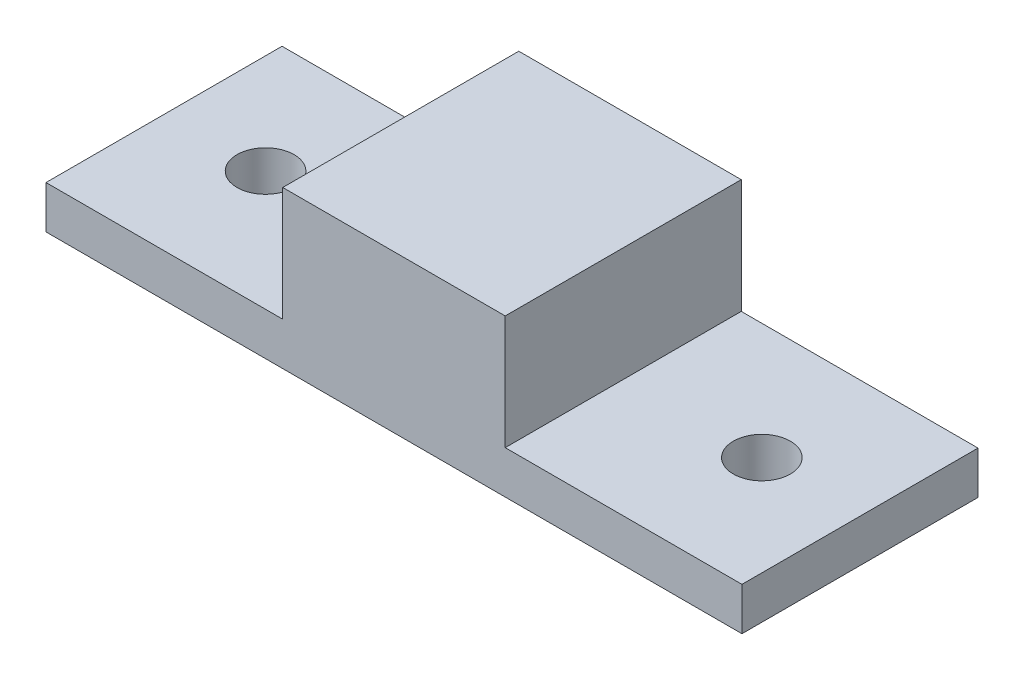
ISO-10303-21;
HEADER;
FILE_DESCRIPTION(('STEP AP214'),'2;1');
FILE_NAME('part.step','',(''),(''),'','','');
FILE_SCHEMA(('AUTOMOTIVE_DESIGN { 1 0 10303 214 1 1 1 1 }'));
ENDSEC;
DATA;
#1=APPLICATION_CONTEXT('core data for automotive mechanical design processes');
#2=APPLICATION_PROTOCOL_DEFINITION('international standard','automotive_design',2000,#1);
#3=PRODUCT_CONTEXT('',#1,'mechanical');
#4=PRODUCT('Part','Part','',(#3));
#5=PRODUCT_RELATED_PRODUCT_CATEGORY('part','',(#4));
#6=PRODUCT_DEFINITION_FORMATION('','',#4);
#7=PRODUCT_DEFINITION_CONTEXT('part definition',#1,'design');
#8=PRODUCT_DEFINITION('design','',#6,#7);
#9=PRODUCT_DEFINITION_SHAPE('','',#8);
#10=(LENGTH_UNIT() NAMED_UNIT(*) SI_UNIT(.MILLI.,.METRE.));
#11=(NAMED_UNIT(*) PLANE_ANGLE_UNIT() SI_UNIT($,.RADIAN.));
#12=(NAMED_UNIT(*) SI_UNIT($,.STERADIAN.) SOLID_ANGLE_UNIT());
#13=UNCERTAINTY_MEASURE_WITH_UNIT(LENGTH_MEASURE(1.E-05),#10,'distance_accuracy_value','');
#14=(GEOMETRIC_REPRESENTATION_CONTEXT(3) GLOBAL_UNCERTAINTY_ASSIGNED_CONTEXT((#13)) GLOBAL_UNIT_ASSIGNED_CONTEXT((#10,
#11,#12)) REPRESENTATION_CONTEXT('',''));
#15=CARTESIAN_POINT('',(0.,0.,0.));
#16=DIRECTION('',(0.,0.,1.));
#17=DIRECTION('',(1.,0.,0.));
#18=AXIS2_PLACEMENT_3D('',#15,#16,#17);
#19=CARTESIAN_POINT('',(0.,3.81,0.));
#20=DIRECTION('',(0.,-1.,0.));
#21=DIRECTION('',(0.,0.,-1.));
#22=AXIS2_PLACEMENT_3D('',#19,#20,#21);
#23=PLANE('',#22);
#24=CARTESIAN_POINT('',(8.89,3.81,-10.6609746324194));
#25=DIRECTION('',(0.,1.,0.));
#26=DIRECTION('',(0.,0.,1.));
#27=AXIS2_PLACEMENT_3D('',#24,#25,#26);
#28=CIRCLE('',#27,2.54);
#29=CARTESIAN_POINT('',(8.89,3.81,-13.2009746324194));
#30=VERTEX_POINT('',#29);
#31=EDGE_CURVE('E133',#30,#30,#28,.T.);
#32=ORIENTED_EDGE('',*,*,#31,.F.);
#33=EDGE_LOOP('',(#32));
#34=FACE_BOUND('',#33,.T.);
#35=DIRECTION('',(0.,0.,1.));
#36=VECTOR('',#35,1.);
#37=CARTESIAN_POINT('',(21.082,3.81,-21.019262));
#38=LINE('',#37,#36);
#39=CARTESIAN_POINT('',(21.082,3.81,-21.019262));
#40=VERTEX_POINT('',#39);
#41=CARTESIAN_POINT('',(21.082,3.81,0.));
#42=VERTEX_POINT('',#41);
#43=EDGE_CURVE('E50',#40,#42,#38,.T.);
#44=ORIENTED_EDGE('',*,*,#43,.F.);
#45=DIRECTION('',(-1.,0.,0.));
#46=VECTOR('',#45,1.);
#47=CARTESIAN_POINT('',(0.,3.81,-21.019262));
#48=LINE('',#47,#46);
#49=CARTESIAN_POINT('',(0.,3.81,-21.019262));
#50=VERTEX_POINT('',#49);
#51=EDGE_CURVE('E148',#40,#50,#48,.T.);
#52=ORIENTED_EDGE('',*,*,#51,.T.);
#53=DIRECTION('',(0.,0.,1.));
#54=VECTOR('',#53,1.);
#55=CARTESIAN_POINT('',(0.,3.81,0.));
#56=LINE('',#55,#54);
#57=CARTESIAN_POINT('',(0.,3.81,0.));
#58=VERTEX_POINT('',#57);
#59=EDGE_CURVE('E139',#50,#58,#56,.T.);
#60=ORIENTED_EDGE('',*,*,#59,.T.);
#61=DIRECTION('',(1.,0.,0.));
#62=VECTOR('',#61,1.);
#63=CARTESIAN_POINT('',(0.,3.81,0.));
#64=LINE('',#63,#62);
#65=EDGE_CURVE('E144',#58,#42,#64,.T.);
#66=ORIENTED_EDGE('',*,*,#65,.T.);
#67=EDGE_LOOP('',(#44,#52,#60,#66));
#68=FACE_BOUND('',#67,.T.);
#69=ADVANCED_FACE('F35',(#34,#68),#23,.F.);
#70=CARTESIAN_POINT('',(53.086,3.81,-10.6609746324194));
#71=DIRECTION('',(0.,1.,0.));
#72=DIRECTION('',(0.,0.,1.));
#73=AXIS2_PLACEMENT_3D('',#70,#71,#72);
#74=CIRCLE('',#73,2.54);
#75=CARTESIAN_POINT('',(53.086,3.81,-13.2009746324194));
#76=VERTEX_POINT('',#75);
#77=EDGE_CURVE('E124',#76,#76,#74,.T.);
#78=ORIENTED_EDGE('',*,*,#77,.F.);
#79=EDGE_LOOP('',(#78));
#80=FACE_BOUND('',#79,.T.);
#81=DIRECTION('',(0.,0.,-1.));
#82=VECTOR('',#81,1.);
#83=CARTESIAN_POINT('',(40.894,3.81,-21.019262));
#84=LINE('',#83,#82);
#85=CARTESIAN_POINT('',(40.894,3.81,0.));
#86=VERTEX_POINT('',#85);
#87=CARTESIAN_POINT('',(40.894,3.81,-21.019262));
#88=VERTEX_POINT('',#87);
#89=EDGE_CURVE('E58',#86,#88,#84,.T.);
#90=ORIENTED_EDGE('',*,*,#89,.F.);
#91=CARTESIAN_POINT('',(61.976,3.81,0.));
#92=VERTEX_POINT('',#91);
#93=EDGE_CURVE('E142',#86,#92,#64,.T.);
#94=ORIENTED_EDGE('',*,*,#93,.T.);
#95=DIRECTION('',(0.,0.,-1.));
#96=VECTOR('',#95,1.);
#97=CARTESIAN_POINT('',(61.976,3.81,0.));
#98=LINE('',#97,#96);
#99=CARTESIAN_POINT('',(61.976,3.81,-21.019262));
#100=VERTEX_POINT('',#99);
#101=EDGE_CURVE('E146',#92,#100,#98,.T.);
#102=ORIENTED_EDGE('',*,*,#101,.T.);
#103=EDGE_CURVE('E149',#100,#88,#48,.T.);
#104=ORIENTED_EDGE('',*,*,#103,.T.);
#105=EDGE_LOOP('',(#90,#94,#102,#104));
#106=FACE_BOUND('',#105,.T.);
#107=ADVANCED_FACE('F192',(#80,#106),#23,.F.);
#108=CARTESIAN_POINT('',(0.,0.,0.));
#109=DIRECTION('',(0.,-1.,0.));
#110=DIRECTION('',(0.,0.,-1.));
#111=AXIS2_PLACEMENT_3D('',#108,#109,#110);
#112=PLANE('',#111);
#113=CARTESIAN_POINT('',(8.89,0.,-10.6609746324194));
#114=DIRECTION('',(0.,1.,0.));
#115=DIRECTION('',(0.,0.,1.));
#116=AXIS2_PLACEMENT_3D('',#113,#114,#115);
#117=CIRCLE('',#116,2.54);
#118=CARTESIAN_POINT('',(8.89,0.,-13.2009746324194));
#119=VERTEX_POINT('',#118);
#120=EDGE_CURVE('E131',#119,#119,#117,.T.);
#121=ORIENTED_EDGE('',*,*,#120,.T.);
#122=EDGE_LOOP('',(#121));
#123=FACE_BOUND('',#122,.T.);
#124=DIRECTION('',(0.,0.,1.));
#125=VECTOR('',#124,1.);
#126=CARTESIAN_POINT('',(0.,0.,0.));
#127=LINE('',#126,#125);
#128=CARTESIAN_POINT('',(0.,0.,-21.019262));
#129=VERTEX_POINT('',#128);
#130=CARTESIAN_POINT('',(0.,0.,0.));
#131=VERTEX_POINT('',#130);
#132=EDGE_CURVE('E136',#129,#131,#127,.T.);
#133=ORIENTED_EDGE('',*,*,#132,.F.);
#134=DIRECTION('',(-1.,0.,0.));
#135=VECTOR('',#134,1.);
#136=CARTESIAN_POINT('',(0.,0.,-21.019262));
#137=LINE('',#136,#135);
#138=CARTESIAN_POINT('',(61.976,0.,-21.019262));
#139=VERTEX_POINT('',#138);
#140=EDGE_CURVE('E143',#139,#129,#137,.T.);
#141=ORIENTED_EDGE('',*,*,#140,.F.);
#142=DIRECTION('',(0.,0.,-1.));
#143=VECTOR('',#142,1.);
#144=CARTESIAN_POINT('',(61.976,0.,0.));
#145=LINE('',#144,#143);
#146=CARTESIAN_POINT('',(61.976,0.,0.));
#147=VERTEX_POINT('',#146);
#148=EDGE_CURVE('E156',#147,#139,#145,.T.);
#149=ORIENTED_EDGE('',*,*,#148,.F.);
#150=DIRECTION('',(1.,0.,0.));
#151=VECTOR('',#150,1.);
#152=CARTESIAN_POINT('',(0.,0.,0.));
#153=LINE('',#152,#151);
#154=EDGE_CURVE('E154',#131,#147,#153,.T.);
#155=ORIENTED_EDGE('',*,*,#154,.F.);
#156=EDGE_LOOP('',(#133,#141,#149,#155));
#157=FACE_BOUND('',#156,.T.);
#158=CARTESIAN_POINT('',(53.086,0.,-10.6609746324194));
#159=DIRECTION('',(0.,1.,0.));
#160=DIRECTION('',(0.,0.,1.));
#161=AXIS2_PLACEMENT_3D('',#158,#159,#160);
#162=CIRCLE('',#161,2.54);
#163=CARTESIAN_POINT('',(53.086,0.,-13.2009746324194));
#164=VERTEX_POINT('',#163);
#165=EDGE_CURVE('E121',#164,#164,#162,.T.);
#166=ORIENTED_EDGE('',*,*,#165,.T.);
#167=EDGE_LOOP('',(#166));
#168=FACE_BOUND('',#167,.T.);
#169=ADVANCED_FACE('F173',(#123,#157,#168),#112,.T.);
#170=CARTESIAN_POINT('',(0.,3.81,0.));
#171=DIRECTION('',(1.,0.,0.));
#172=DIRECTION('',(0.,0.,-1.));
#173=AXIS2_PLACEMENT_3D('',#170,#171,#172);
#174=PLANE('',#173);
#175=ORIENTED_EDGE('',*,*,#132,.T.);
#176=DIRECTION('',(0.,-1.,0.));
#177=VECTOR('',#176,1.);
#178=CARTESIAN_POINT('',(0.,3.81,0.));
#179=LINE('',#178,#177);
#180=EDGE_CURVE('E11',#58,#131,#179,.T.);
#181=ORIENTED_EDGE('',*,*,#180,.F.);
#182=ORIENTED_EDGE('',*,*,#59,.F.);
#183=DIRECTION('',(0.,-1.,0.));
#184=VECTOR('',#183,1.);
#185=CARTESIAN_POINT('',(0.,3.81,-21.019262));
#186=LINE('',#185,#184);
#187=EDGE_CURVE('E151',#50,#129,#186,.T.);
#188=ORIENTED_EDGE('',*,*,#187,.T.);
#189=EDGE_LOOP('',(#175,#181,#182,#188));
#190=FACE_BOUND('',#189,.T.);
#191=ADVANCED_FACE('F37',(#190),#174,.F.);
#192=CARTESIAN_POINT('',(0.,3.81,0.));
#193=DIRECTION('',(0.,0.,-1.));
#194=DIRECTION('',(-1.,0.,0.));
#195=AXIS2_PLACEMENT_3D('',#192,#193,#194);
#196=PLANE('',#195);
#197=ORIENTED_EDGE('',*,*,#154,.T.);
#198=DIRECTION('',(0.,-1.,0.));
#199=VECTOR('',#198,1.);
#200=CARTESIAN_POINT('',(61.976,3.81,0.));
#201=LINE('',#200,#199);
#202=EDGE_CURVE('E43',#92,#147,#201,.T.);
#203=ORIENTED_EDGE('',*,*,#202,.F.);
#204=ORIENTED_EDGE('',*,*,#93,.F.);
#205=DIRECTION('',(0.,-1.,0.));
#206=VECTOR('',#205,1.);
#207=CARTESIAN_POINT('',(40.894,13.97,0.));
#208=LINE('',#207,#206);
#209=CARTESIAN_POINT('',(40.894,13.97,0.));
#210=VERTEX_POINT('',#209);
#211=EDGE_CURVE('E106',#210,#86,#208,.T.);
#212=ORIENTED_EDGE('',*,*,#211,.F.);
#213=DIRECTION('',(1.,0.,0.));
#214=VECTOR('',#213,1.);
#215=CARTESIAN_POINT('',(21.082,13.97,0.));
#216=LINE('',#215,#214);
#217=CARTESIAN_POINT('',(21.082,13.97,0.));
#218=VERTEX_POINT('',#217);
#219=EDGE_CURVE('E100',#218,#210,#216,.T.);
#220=ORIENTED_EDGE('',*,*,#219,.F.);
#221=DIRECTION('',(0.,-1.,0.));
#222=VECTOR('',#221,1.);
#223=CARTESIAN_POINT('',(21.082,13.97,0.));
#224=LINE('',#223,#222);
#225=EDGE_CURVE('E104',#218,#42,#224,.T.);
#226=ORIENTED_EDGE('',*,*,#225,.T.);
#227=ORIENTED_EDGE('',*,*,#65,.F.);
#228=ORIENTED_EDGE('',*,*,#180,.T.);
#229=EDGE_LOOP('',(#197,#203,#204,#212,#220,#226,#227,#228));
#230=FACE_BOUND('',#229,.T.);
#231=ADVANCED_FACE('F102',(#230),#196,.F.);
#232=CARTESIAN_POINT('',(61.976,3.81,0.));
#233=DIRECTION('',(-1.,0.,0.));
#234=DIRECTION('',(0.,0.,1.));
#235=AXIS2_PLACEMENT_3D('',#232,#233,#234);
#236=PLANE('',#235);
#237=ORIENTED_EDGE('',*,*,#148,.T.);
#238=DIRECTION('',(0.,-1.,0.));
#239=VECTOR('',#238,1.);
#240=CARTESIAN_POINT('',(61.976,3.81,-21.019262));
#241=LINE('',#240,#239);
#242=EDGE_CURVE('E161',#100,#139,#241,.T.);
#243=ORIENTED_EDGE('',*,*,#242,.F.);
#244=ORIENTED_EDGE('',*,*,#101,.F.);
#245=ORIENTED_EDGE('',*,*,#202,.T.);
#246=EDGE_LOOP('',(#237,#243,#244,#245));
#247=FACE_BOUND('',#246,.T.);
#248=ADVANCED_FACE('F168',(#247),#236,.F.);
#249=CARTESIAN_POINT('',(0.,3.81,-21.019262));
#250=DIRECTION('',(0.,0.,1.));
#251=DIRECTION('',(1.,0.,0.));
#252=AXIS2_PLACEMENT_3D('',#249,#250,#251);
#253=PLANE('',#252);
#254=ORIENTED_EDGE('',*,*,#140,.T.);
#255=ORIENTED_EDGE('',*,*,#187,.F.);
#256=ORIENTED_EDGE('',*,*,#51,.F.);
#257=DIRECTION('',(0.,-1.,0.));
#258=VECTOR('',#257,1.);
#259=CARTESIAN_POINT('',(21.082,13.97,-21.019262));
#260=LINE('',#259,#258);
#261=CARTESIAN_POINT('',(21.082,13.97,-21.019262));
#262=VERTEX_POINT('',#261);
#263=EDGE_CURVE('E182',#262,#40,#260,.T.);
#264=ORIENTED_EDGE('',*,*,#263,.F.);
#265=DIRECTION('',(-1.,0.,0.));
#266=VECTOR('',#265,1.);
#267=CARTESIAN_POINT('',(21.082,13.97,-21.019262));
#268=LINE('',#267,#266);
#269=CARTESIAN_POINT('',(40.894,13.97,-21.019262));
#270=VERTEX_POINT('',#269);
#271=EDGE_CURVE('E115',#270,#262,#268,.T.);
#272=ORIENTED_EDGE('',*,*,#271,.F.);
#273=DIRECTION('',(0.,-1.,0.));
#274=VECTOR('',#273,1.);
#275=CARTESIAN_POINT('',(40.894,13.97,-21.019262));
#276=LINE('',#275,#274);
#277=EDGE_CURVE('E126',#270,#88,#276,.T.);
#278=ORIENTED_EDGE('',*,*,#277,.T.);
#279=ORIENTED_EDGE('',*,*,#103,.F.);
#280=ORIENTED_EDGE('',*,*,#242,.T.);
#281=EDGE_LOOP('',(#254,#255,#256,#264,#272,#278,#279,#280));
#282=FACE_BOUND('',#281,.T.);
#283=ADVANCED_FACE('F177',(#282),#253,.F.);
#284=CARTESIAN_POINT('',(8.89,3.81,-10.6609746324194));
#285=DIRECTION('',(0.,-1.,0.));
#286=DIRECTION('',(0.,0.,-1.));
#287=AXIS2_PLACEMENT_3D('',#284,#285,#286);
#288=CYLINDRICAL_SURFACE('',#287,2.54);
#289=CARTESIAN_POINT('',(8.89,3.81,-13.2009746324194));
#290=CARTESIAN_POINT('',(8.89,3.7703125,-13.2009746324194));
#291=CARTESIAN_POINT('',(8.89,3.730625,-13.2009746324194));
#292=CARTESIAN_POINT('',(8.89,3.65125,-13.2009746324194));
#293=CARTESIAN_POINT('',(8.89,3.6115625,-13.2009746324194));
#294=CARTESIAN_POINT('',(8.89,3.5321875,-13.2009746324194));
#295=CARTESIAN_POINT('',(8.89,3.4925,-13.2009746324194));
#296=CARTESIAN_POINT('',(8.89,3.413125,-13.2009746324194));
#297=CARTESIAN_POINT('',(8.89,3.3734375,-13.2009746324194));
#298=CARTESIAN_POINT('',(8.89,3.2940625,-13.2009746324194));
#299=CARTESIAN_POINT('',(8.89,3.254375,-13.2009746324194));
#300=CARTESIAN_POINT('',(8.89,3.175,-13.2009746324194));
#301=CARTESIAN_POINT('',(8.89,3.1353125,-13.2009746324194));
#302=CARTESIAN_POINT('',(8.89,3.0559375,-13.2009746324194));
#303=CARTESIAN_POINT('',(8.89,3.01625,-13.2009746324194));
#304=CARTESIAN_POINT('',(8.89,2.936875,-13.2009746324194));
#305=CARTESIAN_POINT('',(8.89,2.8971875,-13.2009746324194));
#306=CARTESIAN_POINT('',(8.89,2.8178125,-13.2009746324194));
#307=CARTESIAN_POINT('',(8.89,2.778125,-13.2009746324194));
#308=CARTESIAN_POINT('',(8.89,2.69875,-13.2009746324194));
#309=CARTESIAN_POINT('',(8.89,2.6590625,-13.2009746324194));
#310=CARTESIAN_POINT('',(8.89,2.5796875,-13.2009746324194));
#311=CARTESIAN_POINT('',(8.89,2.54,-13.2009746324194));
#312=CARTESIAN_POINT('',(8.89,2.460625,-13.2009746324194));
#313=CARTESIAN_POINT('',(8.89,2.4209375,-13.2009746324194));
#314=CARTESIAN_POINT('',(8.89,2.3415625,-13.2009746324194));
#315=CARTESIAN_POINT('',(8.89,2.301875,-13.2009746324194));
#316=CARTESIAN_POINT('',(8.89,2.2225,-13.2009746324194));
#317=CARTESIAN_POINT('',(8.89,2.1828125,-13.2009746324194));
#318=CARTESIAN_POINT('',(8.89,2.1034375,-13.2009746324194));
#319=CARTESIAN_POINT('',(8.89,2.06375,-13.2009746324194));
#320=CARTESIAN_POINT('',(8.89,1.984375,-13.2009746324194));
#321=CARTESIAN_POINT('',(8.89,1.9446875,-13.2009746324194));
#322=CARTESIAN_POINT('',(8.89,1.8653125,-13.2009746324194));
#323=CARTESIAN_POINT('',(8.89,1.825625,-13.2009746324194));
#324=CARTESIAN_POINT('',(8.89,1.74625,-13.2009746324194));
#325=CARTESIAN_POINT('',(8.89,1.7065625,-13.2009746324194));
#326=CARTESIAN_POINT('',(8.89,1.6271875,-13.2009746324194));
#327=CARTESIAN_POINT('',(8.89,1.5875,-13.2009746324194));
#328=CARTESIAN_POINT('',(8.89,1.508125,-13.2009746324194));
#329=CARTESIAN_POINT('',(8.89,1.4684375,-13.2009746324194));
#330=CARTESIAN_POINT('',(8.89,1.3890625,-13.2009746324194));
#331=CARTESIAN_POINT('',(8.89,1.349375,-13.2009746324194));
#332=CARTESIAN_POINT('',(8.89,1.27,-13.2009746324194));
#333=CARTESIAN_POINT('',(8.89,1.2303125,-13.2009746324194));
#334=CARTESIAN_POINT('',(8.89,1.1509375,-13.2009746324194));
#335=CARTESIAN_POINT('',(8.89,1.11125,-13.2009746324194));
#336=CARTESIAN_POINT('',(8.89,1.031875,-13.2009746324194));
#337=CARTESIAN_POINT('',(8.89,0.9921875,-13.2009746324194));
#338=CARTESIAN_POINT('',(8.89,0.9128125,-13.2009746324194));
#339=CARTESIAN_POINT('',(8.89,0.873125,-13.2009746324194));
#340=CARTESIAN_POINT('',(8.89,0.79375,-13.2009746324194));
#341=CARTESIAN_POINT('',(8.89,0.7540625,-13.2009746324194));
#342=CARTESIAN_POINT('',(8.89,0.6746875,-13.2009746324194));
#343=CARTESIAN_POINT('',(8.89,0.635,-13.2009746324194));
#344=CARTESIAN_POINT('',(8.89,0.555625,-13.2009746324194));
#345=CARTESIAN_POINT('',(8.89,0.5159375,-13.2009746324194));
#346=CARTESIAN_POINT('',(8.89,0.4365625,-13.2009746324194));
#347=CARTESIAN_POINT('',(8.89,0.396875,-13.2009746324194));
#348=CARTESIAN_POINT('',(8.89,0.3175,-13.2009746324194));
#349=CARTESIAN_POINT('',(8.89,0.2778125,-13.2009746324194));
#350=CARTESIAN_POINT('',(8.89,0.1984375,-13.2009746324194));
#351=CARTESIAN_POINT('',(8.89,0.15875,-13.2009746324194));
#352=CARTESIAN_POINT('',(8.89,0.0793749999999999,-13.2009746324194));
#353=CARTESIAN_POINT('',(8.89,0.0396874999999999,-13.2009746324194));
#354=CARTESIAN_POINT('',(8.89,0.,-13.2009746324194));
#355=B_SPLINE_CURVE_WITH_KNOTS('',3,(#289,#290,#291,#292,#293,#294,#295,#296,#297,#298,#299,
#300,#301,#302,#303,#304,#305,#306,#307,#308,#309,#310,#311,#312,#313,#314,#315,#316,#317,#318,
#319,#320,#321,#322,#323,#324,#325,#326,#327,#328,#329,#330,#331,#332,#333,#334,#335,#336,#337,
#338,#339,#340,#341,#342,#343,#344,#345,#346,#347,#348,#349,#350,#351,#352,#353,#354),
.UNSPECIFIED.,.F.,.F.,(4,2,2,2,2,2,2,2,2,2,2,2,2,2,2,2,2,2,2,2,2,2,2,2,2,2,2,2,2,2,2,2,4),(0.,
0.1190625,0.238125,0.3571875,0.47625,0.5953125,0.714375,0.8334375,0.9525,1.0715625,1.190625,
1.3096875,1.42875,1.5478125,1.666875,1.7859375,1.905,2.0240625,2.143125,2.2621875,2.38125,
2.5003125,2.619375,2.7384375,2.8575,2.9765625,3.095625,3.2146875,3.33375,3.4528125,3.571875,
3.6909375,3.81),.UNSPECIFIED.);
#356=EDGE_CURVE('BSEAM205',#30,#119,#355,.T.);
#357=ORIENTED_EDGE('',*,*,#31,.T.);
#358=ORIENTED_EDGE('',*,*,#120,.F.);
#359=ORIENTED_EDGE('',*,*,#356,.T.);
#360=ORIENTED_EDGE('',*,*,#356,.F.);
#361=EDGE_LOOP('',(#357,#359,#358,#360));
#362=FACE_BOUND('',#361,.T.);
#363=ADVANCED_FACE('F205',(#362),#288,.F.);
#364=CARTESIAN_POINT('',(53.086,3.81,-10.6609746324194));
#365=DIRECTION('',(0.,-1.,0.));
#366=DIRECTION('',(0.,0.,-1.));
#367=AXIS2_PLACEMENT_3D('',#364,#365,#366);
#368=CYLINDRICAL_SURFACE('',#367,2.54);
#369=CARTESIAN_POINT('',(53.086,3.81,-13.2009746324194));
#370=CARTESIAN_POINT('',(53.086,3.7703125,-13.2009746324194));
#371=CARTESIAN_POINT('',(53.086,3.730625,-13.2009746324194));
#372=CARTESIAN_POINT('',(53.086,3.65125,-13.2009746324194));
#373=CARTESIAN_POINT('',(53.086,3.6115625,-13.2009746324194));
#374=CARTESIAN_POINT('',(53.086,3.5321875,-13.2009746324194));
#375=CARTESIAN_POINT('',(53.086,3.4925,-13.2009746324194));
#376=CARTESIAN_POINT('',(53.086,3.413125,-13.2009746324194));
#377=CARTESIAN_POINT('',(53.086,3.3734375,-13.2009746324194));
#378=CARTESIAN_POINT('',(53.086,3.2940625,-13.2009746324194));
#379=CARTESIAN_POINT('',(53.086,3.254375,-13.2009746324194));
#380=CARTESIAN_POINT('',(53.086,3.175,-13.2009746324194));
#381=CARTESIAN_POINT('',(53.086,3.1353125,-13.2009746324194));
#382=CARTESIAN_POINT('',(53.086,3.0559375,-13.2009746324194));
#383=CARTESIAN_POINT('',(53.086,3.01625,-13.2009746324194));
#384=CARTESIAN_POINT('',(53.086,2.936875,-13.2009746324194));
#385=CARTESIAN_POINT('',(53.086,2.8971875,-13.2009746324194));
#386=CARTESIAN_POINT('',(53.086,2.8178125,-13.2009746324194));
#387=CARTESIAN_POINT('',(53.086,2.778125,-13.2009746324194));
#388=CARTESIAN_POINT('',(53.086,2.69875,-13.2009746324194));
#389=CARTESIAN_POINT('',(53.086,2.6590625,-13.2009746324194));
#390=CARTESIAN_POINT('',(53.086,2.5796875,-13.2009746324194));
#391=CARTESIAN_POINT('',(53.086,2.54,-13.2009746324194));
#392=CARTESIAN_POINT('',(53.086,2.460625,-13.2009746324194));
#393=CARTESIAN_POINT('',(53.086,2.4209375,-13.2009746324194));
#394=CARTESIAN_POINT('',(53.086,2.3415625,-13.2009746324194));
#395=CARTESIAN_POINT('',(53.086,2.301875,-13.2009746324194));
#396=CARTESIAN_POINT('',(53.086,2.2225,-13.2009746324194));
#397=CARTESIAN_POINT('',(53.086,2.1828125,-13.2009746324194));
#398=CARTESIAN_POINT('',(53.086,2.1034375,-13.2009746324194));
#399=CARTESIAN_POINT('',(53.086,2.06375,-13.2009746324194));
#400=CARTESIAN_POINT('',(53.086,1.984375,-13.2009746324194));
#401=CARTESIAN_POINT('',(53.086,1.9446875,-13.2009746324194));
#402=CARTESIAN_POINT('',(53.086,1.8653125,-13.2009746324194));
#403=CARTESIAN_POINT('',(53.086,1.825625,-13.2009746324194));
#404=CARTESIAN_POINT('',(53.086,1.74625,-13.2009746324194));
#405=CARTESIAN_POINT('',(53.086,1.7065625,-13.2009746324194));
#406=CARTESIAN_POINT('',(53.086,1.6271875,-13.2009746324194));
#407=CARTESIAN_POINT('',(53.086,1.5875,-13.2009746324194));
#408=CARTESIAN_POINT('',(53.086,1.508125,-13.2009746324194));
#409=CARTESIAN_POINT('',(53.086,1.4684375,-13.2009746324194));
#410=CARTESIAN_POINT('',(53.086,1.3890625,-13.2009746324194));
#411=CARTESIAN_POINT('',(53.086,1.349375,-13.2009746324194));
#412=CARTESIAN_POINT('',(53.086,1.27,-13.2009746324194));
#413=CARTESIAN_POINT('',(53.086,1.2303125,-13.2009746324194));
#414=CARTESIAN_POINT('',(53.086,1.1509375,-13.2009746324194));
#415=CARTESIAN_POINT('',(53.086,1.11125,-13.2009746324194));
#416=CARTESIAN_POINT('',(53.086,1.031875,-13.2009746324194));
#417=CARTESIAN_POINT('',(53.086,0.9921875,-13.2009746324194));
#418=CARTESIAN_POINT('',(53.086,0.9128125,-13.2009746324194));
#419=CARTESIAN_POINT('',(53.086,0.873125,-13.2009746324194));
#420=CARTESIAN_POINT('',(53.086,0.79375,-13.2009746324194));
#421=CARTESIAN_POINT('',(53.086,0.7540625,-13.2009746324194));
#422=CARTESIAN_POINT('',(53.086,0.6746875,-13.2009746324194));
#423=CARTESIAN_POINT('',(53.086,0.635,-13.2009746324194));
#424=CARTESIAN_POINT('',(53.086,0.555625,-13.2009746324194));
#425=CARTESIAN_POINT('',(53.086,0.5159375,-13.2009746324194));
#426=CARTESIAN_POINT('',(53.086,0.4365625,-13.2009746324194));
#427=CARTESIAN_POINT('',(53.086,0.396875,-13.2009746324194));
#428=CARTESIAN_POINT('',(53.086,0.3175,-13.2009746324194));
#429=CARTESIAN_POINT('',(53.086,0.2778125,-13.2009746324194));
#430=CARTESIAN_POINT('',(53.086,0.1984375,-13.2009746324194));
#431=CARTESIAN_POINT('',(53.086,0.15875,-13.2009746324194));
#432=CARTESIAN_POINT('',(53.086,0.0793749999999999,-13.2009746324194));
#433=CARTESIAN_POINT('',(53.086,0.0396874999999999,-13.2009746324194));
#434=CARTESIAN_POINT('',(53.086,0.,-13.2009746324194));
#435=B_SPLINE_CURVE_WITH_KNOTS('',3,(#369,#370,#371,#372,#373,#374,#375,#376,#377,#378,#379,
#380,#381,#382,#383,#384,#385,#386,#387,#388,#389,#390,#391,#392,#393,#394,#395,#396,#397,#398,
#399,#400,#401,#402,#403,#404,#405,#406,#407,#408,#409,#410,#411,#412,#413,#414,#415,#416,#417,
#418,#419,#420,#421,#422,#423,#424,#425,#426,#427,#428,#429,#430,#431,#432,#433,#434),
.UNSPECIFIED.,.F.,.F.,(4,2,2,2,2,2,2,2,2,2,2,2,2,2,2,2,2,2,2,2,2,2,2,2,2,2,2,2,2,2,2,2,4),(0.,
0.1190625,0.238125,0.3571875,0.47625,0.5953125,0.714375,0.8334375,0.9525,1.0715625,1.190625,
1.3096875,1.42875,1.5478125,1.666875,1.7859375,1.905,2.0240625,2.143125,2.2621875,2.38125,
2.5003125,2.619375,2.7384375,2.8575,2.9765625,3.095625,3.2146875,3.33375,3.4528125,3.571875,
3.6909375,3.81),.UNSPECIFIED.);
#436=EDGE_CURVE('BSEAM253',#76,#164,#435,.T.);
#437=ORIENTED_EDGE('',*,*,#77,.T.);
#438=ORIENTED_EDGE('',*,*,#165,.F.);
#439=ORIENTED_EDGE('',*,*,#436,.T.);
#440=ORIENTED_EDGE('',*,*,#436,.F.);
#441=EDGE_LOOP('',(#437,#439,#438,#440));
#442=FACE_BOUND('',#441,.T.);
#443=ADVANCED_FACE('F253',(#442),#368,.F.);
#444=CARTESIAN_POINT('',(21.082,13.97,-21.019262));
#445=DIRECTION('',(1.,0.,0.));
#446=DIRECTION('',(0.,0.,-1.));
#447=AXIS2_PLACEMENT_3D('',#444,#445,#446);
#448=PLANE('',#447);
#449=ORIENTED_EDGE('',*,*,#43,.T.);
#450=ORIENTED_EDGE('',*,*,#225,.F.);
#451=DIRECTION('',(0.,0.,1.));
#452=VECTOR('',#451,1.);
#453=CARTESIAN_POINT('',(21.082,13.97,-21.019262));
#454=LINE('',#453,#452);
#455=EDGE_CURVE('E110',#262,#218,#454,.T.);
#456=ORIENTED_EDGE('',*,*,#455,.F.);
#457=ORIENTED_EDGE('',*,*,#263,.T.);
#458=EDGE_LOOP('',(#449,#450,#456,#457));
#459=FACE_BOUND('',#458,.T.);
#460=ADVANCED_FACE('F120',(#459),#448,.F.);
#461=CARTESIAN_POINT('',(40.894,13.97,-21.019262));
#462=DIRECTION('',(-1.,0.,0.));
#463=DIRECTION('',(0.,0.,1.));
#464=AXIS2_PLACEMENT_3D('',#461,#462,#463);
#465=PLANE('',#464);
#466=ORIENTED_EDGE('',*,*,#89,.T.);
#467=ORIENTED_EDGE('',*,*,#277,.F.);
#468=DIRECTION('',(0.,0.,-1.));
#469=VECTOR('',#468,1.);
#470=CARTESIAN_POINT('',(40.894,13.97,-21.019262));
#471=LINE('',#470,#469);
#472=EDGE_CURVE('E109',#210,#270,#471,.T.);
#473=ORIENTED_EDGE('',*,*,#472,.F.);
#474=ORIENTED_EDGE('',*,*,#211,.T.);
#475=EDGE_LOOP('',(#466,#467,#473,#474));
#476=FACE_BOUND('',#475,.T.);
#477=ADVANCED_FACE('F191',(#476),#465,.F.);
#478=CARTESIAN_POINT('',(0.,13.97,0.));
#479=DIRECTION('',(0.,1.,0.));
#480=DIRECTION('',(0.,0.,1.));
#481=AXIS2_PLACEMENT_3D('',#478,#479,#480);
#482=PLANE('',#481);
#483=ORIENTED_EDGE('',*,*,#455,.T.);
#484=ORIENTED_EDGE('',*,*,#219,.T.);
#485=ORIENTED_EDGE('',*,*,#472,.T.);
#486=ORIENTED_EDGE('',*,*,#271,.T.);
#487=EDGE_LOOP('',(#483,#484,#485,#486));
#488=FACE_BOUND('',#487,.T.);
#489=ADVANCED_FACE('F113',(#488),#482,.T.);
#490=CLOSED_SHELL('',(#69,#107,#169,#191,#231,#248,#283,#363,#443,#460,#477,#489));
#491=MANIFOLD_SOLID_BREP('B2',#490);
#492=ADVANCED_BREP_SHAPE_REPRESENTATION('',(#18,#491),#14);
#493=SHAPE_DEFINITION_REPRESENTATION(#9,#492);
ENDSEC;
END-ISO-10303-21;
